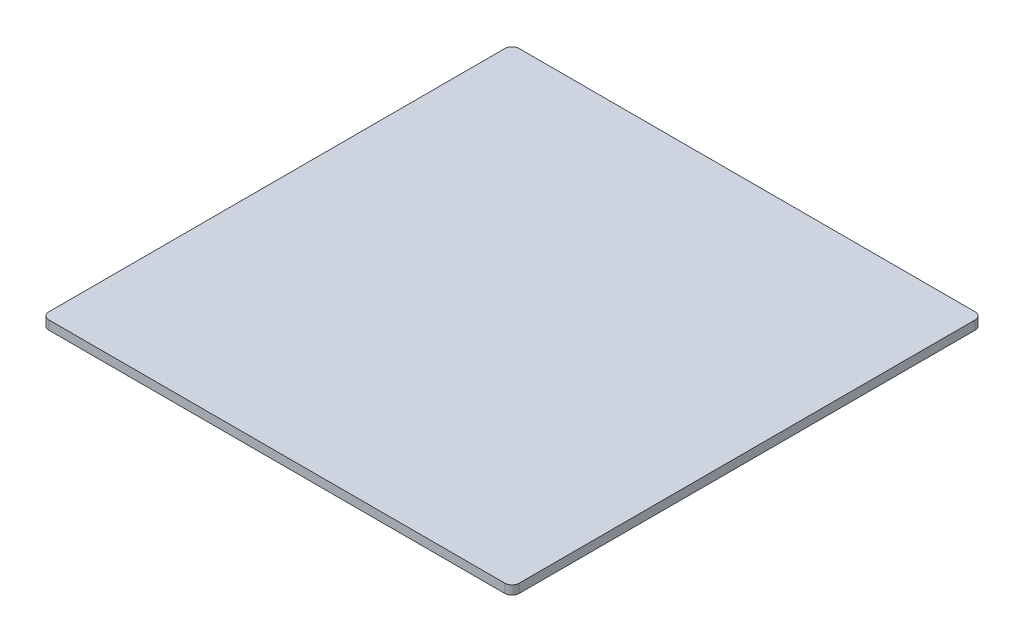
ISO-10303-21;
HEADER;
FILE_DESCRIPTION(('STEP AP214'),'2;1');
FILE_NAME('part.step','',(''),(''),'','','');
FILE_SCHEMA(('AUTOMOTIVE_DESIGN { 1 0 10303 214 1 1 1 1 }'));
ENDSEC;
DATA;
#1=APPLICATION_CONTEXT('core data for automotive mechanical design processes');
#2=APPLICATION_PROTOCOL_DEFINITION('international standard','automotive_design',2000,#1);
#3=PRODUCT_CONTEXT('',#1,'mechanical');
#4=PRODUCT('Part','Part','',(#3));
#5=PRODUCT_RELATED_PRODUCT_CATEGORY('part','',(#4));
#6=PRODUCT_DEFINITION_FORMATION('','',#4);
#7=PRODUCT_DEFINITION_CONTEXT('part definition',#1,'design');
#8=PRODUCT_DEFINITION('design','',#6,#7);
#9=PRODUCT_DEFINITION_SHAPE('','',#8);
#10=(LENGTH_UNIT() NAMED_UNIT(*) SI_UNIT(.MILLI.,.METRE.));
#11=(NAMED_UNIT(*) PLANE_ANGLE_UNIT() SI_UNIT($,.RADIAN.));
#12=(NAMED_UNIT(*) SI_UNIT($,.STERADIAN.) SOLID_ANGLE_UNIT());
#13=UNCERTAINTY_MEASURE_WITH_UNIT(LENGTH_MEASURE(1.E-05),#10,'distance_accuracy_value','');
#14=(GEOMETRIC_REPRESENTATION_CONTEXT(3) GLOBAL_UNCERTAINTY_ASSIGNED_CONTEXT((#13)) GLOBAL_UNIT_ASSIGNED_CONTEXT((#10,
#11,#12)) REPRESENTATION_CONTEXT('',''));
#15=CARTESIAN_POINT('',(0.,0.,0.));
#16=DIRECTION('',(0.,0.,1.));
#17=DIRECTION('',(1.,0.,0.));
#18=AXIS2_PLACEMENT_3D('',#15,#16,#17);
#19=CARTESIAN_POINT('',(50.,0.95,50.));
#20=DIRECTION('',(-1.,0.,0.));
#21=DIRECTION('',(0.,0.,1.));
#22=AXIS2_PLACEMENT_3D('',#19,#20,#21);
#23=PLANE('',#22);
#24=DIRECTION('',(0.,0.,-1.));
#25=VECTOR('',#24,1.);
#26=CARTESIAN_POINT('',(50.,-0.95,50.));
#27=LINE('',#26,#25);
#28=CARTESIAN_POINT('',(50.,-0.95,48.5));
#29=VERTEX_POINT('',#28);
#30=CARTESIAN_POINT('',(50.,-0.95,-48.5));
#31=VERTEX_POINT('',#30);
#32=EDGE_CURVE('E181',#29,#31,#27,.T.);
#33=ORIENTED_EDGE('',*,*,#32,.T.);
#34=DIRECTION('',(0.,-1.,0.));
#35=VECTOR('',#34,1.);
#36=CARTESIAN_POINT('',(50.,0.95,-48.5));
#37=LINE('',#36,#35);
#38=CARTESIAN_POINT('',(50.,0.95,-48.5));
#39=VERTEX_POINT('',#38);
#40=EDGE_CURVE('E11',#31,#39,#37,.F.);
#41=ORIENTED_EDGE('',*,*,#40,.T.);
#42=DIRECTION('',(0.,0.,-1.));
#43=VECTOR('',#42,1.);
#44=CARTESIAN_POINT('',(50.,0.95,50.));
#45=LINE('',#44,#43);
#46=CARTESIAN_POINT('',(50.,0.95,48.5));
#47=VERTEX_POINT('',#46);
#48=EDGE_CURVE('E134',#47,#39,#45,.T.);
#49=ORIENTED_EDGE('',*,*,#48,.F.);
#50=DIRECTION('',(0.,-1.,0.));
#51=VECTOR('',#50,1.);
#52=CARTESIAN_POINT('',(50.,0.95,48.5));
#53=LINE('',#52,#51);
#54=EDGE_CURVE('E47',#47,#29,#53,.T.);
#55=ORIENTED_EDGE('',*,*,#54,.T.);
#56=EDGE_LOOP('',(#33,#41,#49,#55));
#57=FACE_BOUND('',#56,.T.);
#58=ADVANCED_FACE('F38',(#57),#23,.F.);
#59=CARTESIAN_POINT('',(-50.,0.95,-50.));
#60=DIRECTION('',(0.,0.,1.));
#61=DIRECTION('',(1.,0.,0.));
#62=AXIS2_PLACEMENT_3D('',#59,#60,#61);
#63=PLANE('',#62);
#64=DIRECTION('',(-1.,0.,0.));
#65=VECTOR('',#64,1.);
#66=CARTESIAN_POINT('',(-50.,-0.95,-50.));
#67=LINE('',#66,#65);
#68=CARTESIAN_POINT('',(48.5,-0.95,-50.));
#69=VERTEX_POINT('',#68);
#70=CARTESIAN_POINT('',(-48.5,-0.95,-50.));
#71=VERTEX_POINT('',#70);
#72=EDGE_CURVE('E141',#69,#71,#67,.T.);
#73=ORIENTED_EDGE('',*,*,#72,.T.);
#74=DIRECTION('',(0.,-1.,0.));
#75=VECTOR('',#74,1.);
#76=CARTESIAN_POINT('',(-48.5,0.95,-50.));
#77=LINE('',#76,#75);
#78=CARTESIAN_POINT('',(-48.5,0.95,-50.));
#79=VERTEX_POINT('',#78);
#80=EDGE_CURVE('E54',#71,#79,#77,.F.);
#81=ORIENTED_EDGE('',*,*,#80,.T.);
#82=DIRECTION('',(-1.,0.,0.));
#83=VECTOR('',#82,1.);
#84=CARTESIAN_POINT('',(-50.,0.95,-50.));
#85=LINE('',#84,#83);
#86=CARTESIAN_POINT('',(48.5,0.95,-50.));
#87=VERTEX_POINT('',#86);
#88=EDGE_CURVE('E139',#87,#79,#85,.T.);
#89=ORIENTED_EDGE('',*,*,#88,.F.);
#90=DIRECTION('',(0.,-1.,0.));
#91=VECTOR('',#90,1.);
#92=CARTESIAN_POINT('',(48.5,0.95,-50.));
#93=LINE('',#92,#91);
#94=EDGE_CURVE('E170',#87,#69,#93,.T.);
#95=ORIENTED_EDGE('',*,*,#94,.T.);
#96=EDGE_LOOP('',(#73,#81,#89,#95));
#97=FACE_BOUND('',#96,.T.);
#98=ADVANCED_FACE('F206',(#97),#63,.F.);
#99=CARTESIAN_POINT('',(-50.,0.95,50.));
#100=DIRECTION('',(1.,0.,0.));
#101=DIRECTION('',(0.,0.,-1.));
#102=AXIS2_PLACEMENT_3D('',#99,#100,#101);
#103=PLANE('',#102);
#104=DIRECTION('',(0.,0.,1.));
#105=VECTOR('',#104,1.);
#106=CARTESIAN_POINT('',(-50.,-0.95,50.));
#107=LINE('',#106,#105);
#108=CARTESIAN_POINT('',(-50.,-0.95,-48.5));
#109=VERTEX_POINT('',#108);
#110=CARTESIAN_POINT('',(-50.,-0.95,48.5));
#111=VERTEX_POINT('',#110);
#112=EDGE_CURVE('E135',#109,#111,#107,.T.);
#113=ORIENTED_EDGE('',*,*,#112,.T.);
#114=DIRECTION('',(0.,-1.,0.));
#115=VECTOR('',#114,1.);
#116=CARTESIAN_POINT('',(-50.,0.95,48.5));
#117=LINE('',#116,#115);
#118=CARTESIAN_POINT('',(-50.,0.95,48.5));
#119=VERTEX_POINT('',#118);
#120=EDGE_CURVE('E110',#111,#119,#117,.F.);
#121=ORIENTED_EDGE('',*,*,#120,.T.);
#122=DIRECTION('',(0.,0.,1.));
#123=VECTOR('',#122,1.);
#124=CARTESIAN_POINT('',(-50.,0.95,50.));
#125=LINE('',#124,#123);
#126=CARTESIAN_POINT('',(-50.,0.95,-48.5));
#127=VERTEX_POINT('',#126);
#128=EDGE_CURVE('E192',#127,#119,#125,.T.);
#129=ORIENTED_EDGE('',*,*,#128,.F.);
#130=DIRECTION('',(0.,-1.,0.));
#131=VECTOR('',#130,1.);
#132=CARTESIAN_POINT('',(-50.,0.95,-48.5));
#133=LINE('',#132,#131);
#134=EDGE_CURVE('E116',#127,#109,#133,.T.);
#135=ORIENTED_EDGE('',*,*,#134,.T.);
#136=EDGE_LOOP('',(#113,#121,#129,#135));
#137=FACE_BOUND('',#136,.T.);
#138=ADVANCED_FACE('F205',(#137),#103,.F.);
#139=CARTESIAN_POINT('',(-50.,0.95,50.));
#140=DIRECTION('',(0.,0.,-1.));
#141=DIRECTION('',(-1.,0.,0.));
#142=AXIS2_PLACEMENT_3D('',#139,#140,#141);
#143=PLANE('',#142);
#144=DIRECTION('',(1.,0.,0.));
#145=VECTOR('',#144,1.);
#146=CARTESIAN_POINT('',(-50.,0.95,50.));
#147=LINE('',#146,#145);
#148=CARTESIAN_POINT('',(-48.5,0.95,50.));
#149=VERTEX_POINT('',#148);
#150=CARTESIAN_POINT('',(48.5,0.95,50.));
#151=VERTEX_POINT('',#150);
#152=EDGE_CURVE('E126',#149,#151,#147,.T.);
#153=ORIENTED_EDGE('',*,*,#152,.F.);
#154=DIRECTION('',(0.,-1.,0.));
#155=VECTOR('',#154,1.);
#156=CARTESIAN_POINT('',(-48.5,0.95,50.));
#157=LINE('',#156,#155);
#158=CARTESIAN_POINT('',(-48.5,-0.95,50.));
#159=VERTEX_POINT('',#158);
#160=EDGE_CURVE('E109',#149,#159,#157,.T.);
#161=ORIENTED_EDGE('',*,*,#160,.T.);
#162=DIRECTION('',(1.,0.,0.));
#163=VECTOR('',#162,1.);
#164=CARTESIAN_POINT('',(-50.,-0.95,50.));
#165=LINE('',#164,#163);
#166=CARTESIAN_POINT('',(48.5,-0.95,50.));
#167=VERTEX_POINT('',#166);
#168=EDGE_CURVE('E123',#159,#167,#165,.T.);
#169=ORIENTED_EDGE('',*,*,#168,.T.);
#170=DIRECTION('',(0.,-1.,0.));
#171=VECTOR('',#170,1.);
#172=CARTESIAN_POINT('',(48.5,0.95,50.));
#173=LINE('',#172,#171);
#174=EDGE_CURVE('E129',#167,#151,#173,.F.);
#175=ORIENTED_EDGE('',*,*,#174,.T.);
#176=EDGE_LOOP('',(#153,#161,#169,#175));
#177=FACE_BOUND('',#176,.T.);
#178=ADVANCED_FACE('F122',(#177),#143,.F.);
#179=CARTESIAN_POINT('',(0.,0.95,0.));
#180=DIRECTION('',(0.,-1.,0.));
#181=DIRECTION('',(0.,0.,-1.));
#182=AXIS2_PLACEMENT_3D('',#179,#180,#181);
#183=PLANE('',#182);
#184=ORIENTED_EDGE('',*,*,#128,.T.);
#185=CARTESIAN_POINT('',(-48.5,0.95,48.5));
#186=DIRECTION('',(0.,-1.,0.));
#187=DIRECTION('',(0.,0.,-1.));
#188=AXIS2_PLACEMENT_3D('',#185,#186,#187);
#189=CIRCLE('',#188,1.5);
#190=EDGE_CURVE('E167',#119,#149,#189,.F.);
#191=ORIENTED_EDGE('',*,*,#190,.T.);
#192=ORIENTED_EDGE('',*,*,#152,.T.);
#193=CARTESIAN_POINT('',(48.5,0.95,48.5));
#194=DIRECTION('',(0.,-1.,0.));
#195=DIRECTION('',(0.,0.,-1.));
#196=AXIS2_PLACEMENT_3D('',#193,#194,#195);
#197=CIRCLE('',#196,1.5);
#198=EDGE_CURVE('E159',#151,#47,#197,.F.);
#199=ORIENTED_EDGE('',*,*,#198,.T.);
#200=ORIENTED_EDGE('',*,*,#48,.T.);
#201=CARTESIAN_POINT('',(48.5,0.95,-48.5));
#202=DIRECTION('',(0.,-1.,0.));
#203=DIRECTION('',(0.,0.,-1.));
#204=AXIS2_PLACEMENT_3D('',#201,#202,#203);
#205=CIRCLE('',#204,1.5);
#206=EDGE_CURVE('E61',#39,#87,#205,.F.);
#207=ORIENTED_EDGE('',*,*,#206,.T.);
#208=ORIENTED_EDGE('',*,*,#88,.T.);
#209=CARTESIAN_POINT('',(-48.5,0.95,-48.5));
#210=DIRECTION('',(0.,-1.,0.));
#211=DIRECTION('',(0.,0.,-1.));
#212=AXIS2_PLACEMENT_3D('',#209,#210,#211);
#213=CIRCLE('',#212,1.5);
#214=EDGE_CURVE('E164',#79,#127,#213,.F.);
#215=ORIENTED_EDGE('',*,*,#214,.T.);
#216=EDGE_LOOP('',(#184,#191,#192,#199,#200,#207,#208,#215));
#217=FACE_BOUND('',#216,.T.);
#218=ADVANCED_FACE('F198',(#217),#183,.F.);
#219=CARTESIAN_POINT('',(0.,-0.95,0.));
#220=DIRECTION('',(0.,-1.,0.));
#221=DIRECTION('',(0.,0.,-1.));
#222=AXIS2_PLACEMENT_3D('',#219,#220,#221);
#223=PLANE('',#222);
#224=ORIENTED_EDGE('',*,*,#168,.F.);
#225=CARTESIAN_POINT('',(-48.5,-0.95,48.5));
#226=DIRECTION('',(0.,-1.,0.));
#227=DIRECTION('',(0.,0.,-1.));
#228=AXIS2_PLACEMENT_3D('',#225,#226,#227);
#229=CIRCLE('',#228,1.5);
#230=EDGE_CURVE('E105',#159,#111,#229,.T.);
#231=ORIENTED_EDGE('',*,*,#230,.T.);
#232=ORIENTED_EDGE('',*,*,#112,.F.);
#233=CARTESIAN_POINT('',(-48.5,-0.95,-48.5));
#234=DIRECTION('',(0.,-1.,0.));
#235=DIRECTION('',(0.,0.,-1.));
#236=AXIS2_PLACEMENT_3D('',#233,#234,#235);
#237=CIRCLE('',#236,1.5);
#238=EDGE_CURVE('E117',#109,#71,#237,.T.);
#239=ORIENTED_EDGE('',*,*,#238,.T.);
#240=ORIENTED_EDGE('',*,*,#72,.F.);
#241=CARTESIAN_POINT('',(48.5,-0.95,-48.5));
#242=DIRECTION('',(0.,-1.,0.));
#243=DIRECTION('',(0.,0.,-1.));
#244=AXIS2_PLACEMENT_3D('',#241,#242,#243);
#245=CIRCLE('',#244,1.5);
#246=EDGE_CURVE('E149',#69,#31,#245,.T.);
#247=ORIENTED_EDGE('',*,*,#246,.T.);
#248=ORIENTED_EDGE('',*,*,#32,.F.);
#249=CARTESIAN_POINT('',(48.5,-0.95,48.5));
#250=DIRECTION('',(0.,-1.,0.));
#251=DIRECTION('',(0.,0.,-1.));
#252=AXIS2_PLACEMENT_3D('',#249,#250,#251);
#253=CIRCLE('',#252,1.5);
#254=EDGE_CURVE('E128',#29,#167,#253,.T.);
#255=ORIENTED_EDGE('',*,*,#254,.T.);
#256=EDGE_LOOP('',(#224,#231,#232,#239,#240,#247,#248,#255));
#257=FACE_BOUND('',#256,.T.);
#258=ADVANCED_FACE('F131',(#257),#223,.T.);
#259=CARTESIAN_POINT('',(-48.5,0.95,48.5));
#260=DIRECTION('',(0.,-1.,0.));
#261=DIRECTION('',(0.,0.,-1.));
#262=AXIS2_PLACEMENT_3D('',#259,#260,#261);
#263=CYLINDRICAL_SURFACE('',#262,1.5);
#264=ORIENTED_EDGE('',*,*,#190,.F.);
#265=ORIENTED_EDGE('',*,*,#120,.F.);
#266=ORIENTED_EDGE('',*,*,#230,.F.);
#267=ORIENTED_EDGE('',*,*,#160,.F.);
#268=EDGE_LOOP('',(#264,#265,#266,#267));
#269=FACE_BOUND('',#268,.T.);
#270=ADVANCED_FACE('F108',(#269),#263,.T.);
#271=CARTESIAN_POINT('',(-48.5,0.95,-48.5));
#272=DIRECTION('',(0.,-1.,0.));
#273=DIRECTION('',(0.,0.,-1.));
#274=AXIS2_PLACEMENT_3D('',#271,#272,#273);
#275=CYLINDRICAL_SURFACE('',#274,1.5);
#276=ORIENTED_EDGE('',*,*,#214,.F.);
#277=ORIENTED_EDGE('',*,*,#80,.F.);
#278=ORIENTED_EDGE('',*,*,#238,.F.);
#279=ORIENTED_EDGE('',*,*,#134,.F.);
#280=EDGE_LOOP('',(#276,#277,#278,#279));
#281=FACE_BOUND('',#280,.T.);
#282=ADVANCED_FACE('F203',(#281),#275,.T.);
#283=CARTESIAN_POINT('',(48.5,0.95,-48.5));
#284=DIRECTION('',(0.,-1.,0.));
#285=DIRECTION('',(0.,0.,-1.));
#286=AXIS2_PLACEMENT_3D('',#283,#284,#285);
#287=CYLINDRICAL_SURFACE('',#286,1.5);
#288=ORIENTED_EDGE('',*,*,#206,.F.);
#289=ORIENTED_EDGE('',*,*,#40,.F.);
#290=ORIENTED_EDGE('',*,*,#246,.F.);
#291=ORIENTED_EDGE('',*,*,#94,.F.);
#292=EDGE_LOOP('',(#288,#289,#290,#291));
#293=FACE_BOUND('',#292,.T.);
#294=ADVANCED_FACE('F208',(#293),#287,.T.);
#295=CARTESIAN_POINT('',(48.5,0.95,48.5));
#296=DIRECTION('',(0.,-1.,0.));
#297=DIRECTION('',(0.,0.,-1.));
#298=AXIS2_PLACEMENT_3D('',#295,#296,#297);
#299=CYLINDRICAL_SURFACE('',#298,1.5);
#300=ORIENTED_EDGE('',*,*,#198,.F.);
#301=ORIENTED_EDGE('',*,*,#174,.F.);
#302=ORIENTED_EDGE('',*,*,#254,.F.);
#303=ORIENTED_EDGE('',*,*,#54,.F.);
#304=EDGE_LOOP('',(#300,#301,#302,#303));
#305=FACE_BOUND('',#304,.T.);
#306=ADVANCED_FACE('F40',(#305),#299,.T.);
#307=CLOSED_SHELL('',(#58,#98,#138,#178,#218,#258,#270,#282,#294,#306));
#308=MANIFOLD_SOLID_BREP('B2',#307);
#309=ADVANCED_BREP_SHAPE_REPRESENTATION('',(#18,#308),#14);
#310=SHAPE_DEFINITION_REPRESENTATION(#9,#309);
ENDSEC;
END-ISO-10303-21;
